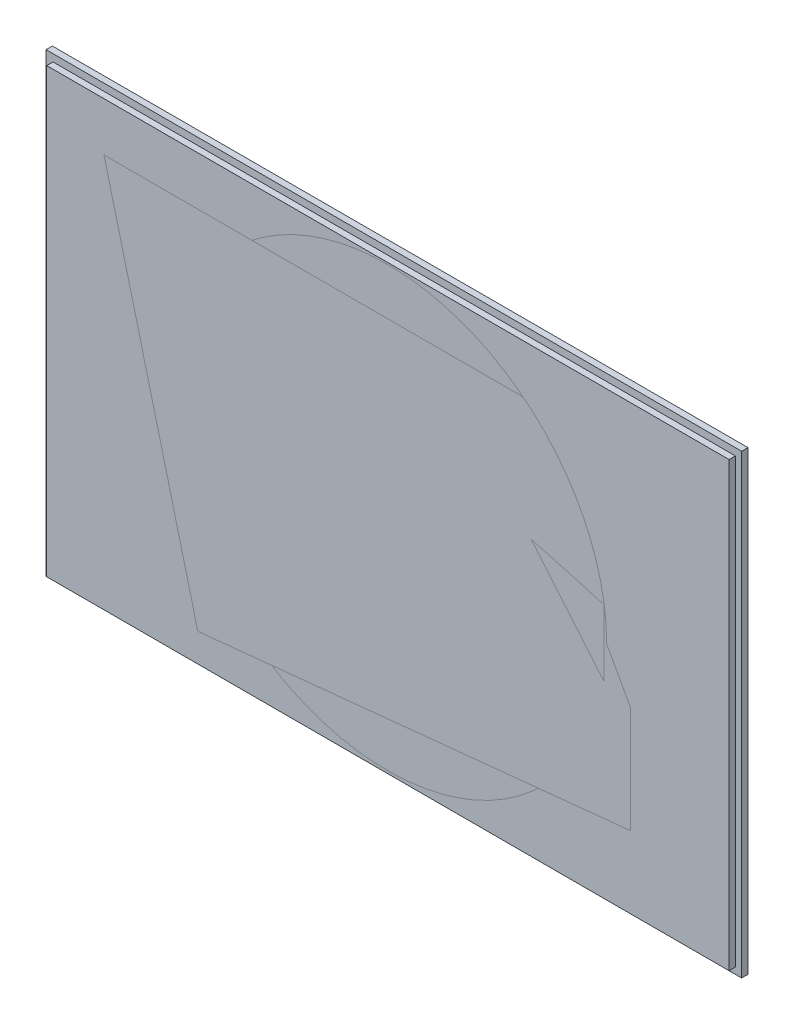
ISO-10303-21;
HEADER;
FILE_DESCRIPTION(('STEP AP214'),'2;1');
FILE_NAME('part.step','',(''),(''),'','','');
FILE_SCHEMA(('AUTOMOTIVE_DESIGN { 1 0 10303 214 1 1 1 1 }'));
ENDSEC;
DATA;
#1=APPLICATION_CONTEXT('core data for automotive mechanical design processes');
#2=APPLICATION_PROTOCOL_DEFINITION('international standard','automotive_design',2000,#1);
#3=PRODUCT_CONTEXT('',#1,'mechanical');
#4=PRODUCT('Part','Part','',(#3));
#5=PRODUCT_RELATED_PRODUCT_CATEGORY('part','',(#4));
#6=PRODUCT_DEFINITION_FORMATION('','',#4);
#7=PRODUCT_DEFINITION_CONTEXT('part definition',#1,'design');
#8=PRODUCT_DEFINITION('design','',#6,#7);
#9=PRODUCT_DEFINITION_SHAPE('','',#8);
#10=(LENGTH_UNIT() NAMED_UNIT(*) SI_UNIT(.MILLI.,.METRE.));
#11=(NAMED_UNIT(*) PLANE_ANGLE_UNIT() SI_UNIT($,.RADIAN.));
#12=(NAMED_UNIT(*) SI_UNIT($,.STERADIAN.) SOLID_ANGLE_UNIT());
#13=UNCERTAINTY_MEASURE_WITH_UNIT(LENGTH_MEASURE(1.E-05),#10,'distance_accuracy_value','');
#14=(GEOMETRIC_REPRESENTATION_CONTEXT(3) GLOBAL_UNCERTAINTY_ASSIGNED_CONTEXT((#13)) GLOBAL_UNIT_ASSIGNED_CONTEXT((#10,
#11,#12)) REPRESENTATION_CONTEXT('',''));
#15=CARTESIAN_POINT('',(0.,0.,0.));
#16=DIRECTION('',(0.,0.,1.));
#17=DIRECTION('',(1.,0.,0.));
#18=AXIS2_PLACEMENT_3D('',#15,#16,#17);
#19=CARTESIAN_POINT('',(0.,0.,4.));
#20=DIRECTION('',(0.,0.,-1.));
#21=DIRECTION('',(-1.,0.,0.));
#22=AXIS2_PLACEMENT_3D('',#19,#20,#21);
#23=CYLINDRICAL_SURFACE('',#22,69.248780578544);
#24=CARTESIAN_POINT('',(0.,0.,4.));
#25=DIRECTION('',(0.,0.,1.));
#26=DIRECTION('',(1.,0.,0.));
#27=AXIS2_PLACEMENT_3D('',#24,#25,#26);
#28=CIRCLE('',#27,69.248780578544);
#29=CARTESIAN_POINT('',(69.248780578544,0.,4.));
#30=VERTEX_POINT('',#29);
#31=EDGE_CURVE('E11',#30,#30,#28,.T.);
#32=ORIENTED_EDGE('',*,*,#31,.F.);
#33=EDGE_LOOP('',(#32));
#34=FACE_BOUND('',#33,.T.);
#35=CARTESIAN_POINT('',(0.,0.,2.));
#36=DIRECTION('',(0.,0.,1.));
#37=DIRECTION('',(1.,0.,0.));
#38=AXIS2_PLACEMENT_3D('',#35,#36,#37);
#39=CIRCLE('',#38,69.248780578544);
#40=CARTESIAN_POINT('',(69.248780578544,0.,2.));
#41=VERTEX_POINT('',#40);
#42=EDGE_CURVE('E47',#41,#41,#39,.T.);
#43=ORIENTED_EDGE('',*,*,#42,.T.);
#44=EDGE_LOOP('',(#43));
#45=FACE_BOUND('',#44,.T.);
#46=ADVANCED_FACE('F44',(#34,#45),#23,.T.);
#47=CARTESIAN_POINT('',(0.,0.,4.));
#48=DIRECTION('',(0.,0.,1.));
#49=DIRECTION('',(1.,0.,0.));
#50=AXIS2_PLACEMENT_3D('',#47,#48,#49);
#51=PLANE('',#50);
#52=ORIENTED_EDGE('',*,*,#31,.T.);
#53=EDGE_LOOP('',(#52));
#54=FACE_BOUND('',#53,.T.);
#55=ADVANCED_FACE('F59',(#54),#51,.T.);
#56=CARTESIAN_POINT('',(0.,0.,2.));
#57=DIRECTION('',(0.,0.,1.));
#58=DIRECTION('',(1.,0.,0.));
#59=AXIS2_PLACEMENT_3D('',#56,#57,#58);
#60=PLANE('',#59);
#61=ORIENTED_EDGE('',*,*,#42,.F.);
#62=EDGE_LOOP('',(#61));
#63=FACE_BOUND('',#62,.T.);
#64=ADVANCED_FACE('F57',(#63),#60,.F.);
#65=CLOSED_SHELL('',(#46,#55,#64));
#66=MANIFOLD_SOLID_BREP('B2_NOT_SHOWN',#65);
#67=CARTESIAN_POINT('',(0.,0.,4.));
#68=DIRECTION('',(0.,0.,1.));
#69=DIRECTION('',(1.,0.,0.));
#70=AXIS2_PLACEMENT_3D('',#67,#68,#69);
#71=PLANE('',#70);
#72=DIRECTION('',(0.,-1.,0.));
#73=VECTOR('',#72,1.);
#74=CARTESIAN_POINT('',(-107.655471031834,69.8068653838549,4.));
#75=LINE('',#74,#73);
#76=CARTESIAN_POINT('',(-107.655471031834,69.8068653838549,4.));
#77=VERTEX_POINT('',#76);
#78=CARTESIAN_POINT('',(-107.655471031834,-70.0575184013911,4.));
#79=VERTEX_POINT('',#78);
#80=EDGE_CURVE('E147',#77,#79,#75,.T.);
#81=ORIENTED_EDGE('',*,*,#80,.T.);
#82=DIRECTION('',(1.,0.,0.));
#83=VECTOR('',#82,1.);
#84=CARTESIAN_POINT('',(-107.655471031834,-70.0575184013911,4.));
#85=LINE('',#84,#83);
#86=CARTESIAN_POINT('',(107.90612404937,-70.0575184013911,4.));
#87=VERTEX_POINT('',#86);
#88=EDGE_CURVE('E142',#79,#87,#85,.T.);
#89=ORIENTED_EDGE('',*,*,#88,.T.);
#90=DIRECTION('',(0.,1.,0.));
#91=VECTOR('',#90,1.);
#92=CARTESIAN_POINT('',(107.90612404937,69.8068653838549,4.));
#93=LINE('',#92,#91);
#94=CARTESIAN_POINT('',(107.90612404937,69.8068653838549,4.));
#95=VERTEX_POINT('',#94);
#96=EDGE_CURVE('E145',#87,#95,#93,.T.);
#97=ORIENTED_EDGE('',*,*,#96,.T.);
#98=DIRECTION('',(-1.,0.,0.));
#99=VECTOR('',#98,1.);
#100=CARTESIAN_POINT('',(-107.655471031834,69.8068653838549,4.));
#101=LINE('',#100,#99);
#102=EDGE_CURVE('E112',#95,#77,#101,.T.);
#103=ORIENTED_EDGE('',*,*,#102,.T.);
#104=EDGE_LOOP('',(#81,#89,#97,#103));
#105=FACE_BOUND('',#104,.T.);
#106=CARTESIAN_POINT('',(0.,0.,4.));
#107=DIRECTION('',(0.,0.,1.));
#108=DIRECTION('',(1.,0.,0.));
#109=AXIS2_PLACEMENT_3D('',#106,#107,#108);
#110=CIRCLE('',#109,69.248780578544);
#111=CARTESIAN_POINT('',(69.248780578544,0.,4.));
#112=VERTEX_POINT('',#111);
#113=EDGE_CURVE('E162',#112,#112,#110,.T.);
#114=ORIENTED_EDGE('',*,*,#113,.F.);
#115=EDGE_LOOP('',(#114));
#116=FACE_BOUND('',#115,.T.);
#117=ADVANCED_FACE('F95',(#105,#116),#71,.T.);
#118=CARTESIAN_POINT('',(0.,0.,2.));
#119=DIRECTION('',(0.,0.,1.));
#120=DIRECTION('',(1.,0.,0.));
#121=AXIS2_PLACEMENT_3D('',#118,#119,#120);
#122=PLANE('',#121);
#123=DIRECTION('',(0.,-1.,0.));
#124=VECTOR('',#123,1.);
#125=CARTESIAN_POINT('',(-107.655471031834,69.8068653838549,2.));
#126=LINE('',#125,#124);
#127=CARTESIAN_POINT('',(-107.655471031834,69.8068653838549,2.));
#128=VERTEX_POINT('',#127);
#129=CARTESIAN_POINT('',(-107.655471031834,-70.0575184013911,2.));
#130=VERTEX_POINT('',#129);
#131=EDGE_CURVE('E159',#128,#130,#126,.T.);
#132=ORIENTED_EDGE('',*,*,#131,.F.);
#133=DIRECTION('',(-1.,0.,0.));
#134=VECTOR('',#133,1.);
#135=CARTESIAN_POINT('',(-107.655471031834,69.8068653838549,2.));
#136=LINE('',#135,#134);
#137=CARTESIAN_POINT('',(107.90612404937,69.8068653838549,2.));
#138=VERTEX_POINT('',#137);
#139=EDGE_CURVE('E135',#138,#128,#136,.T.);
#140=ORIENTED_EDGE('',*,*,#139,.F.);
#141=DIRECTION('',(0.,1.,0.));
#142=VECTOR('',#141,1.);
#143=CARTESIAN_POINT('',(107.90612404937,69.8068653838549,2.));
#144=LINE('',#143,#142);
#145=CARTESIAN_POINT('',(107.90612404937,-70.0575184013911,2.));
#146=VERTEX_POINT('',#145);
#147=EDGE_CURVE('E129',#146,#138,#144,.T.);
#148=ORIENTED_EDGE('',*,*,#147,.F.);
#149=DIRECTION('',(1.,0.,0.));
#150=VECTOR('',#149,1.);
#151=CARTESIAN_POINT('',(-107.655471031834,-70.0575184013911,2.));
#152=LINE('',#151,#150);
#153=EDGE_CURVE('E151',#130,#146,#152,.T.);
#154=ORIENTED_EDGE('',*,*,#153,.F.);
#155=EDGE_LOOP('',(#132,#140,#148,#154));
#156=FACE_BOUND('',#155,.T.);
#157=CARTESIAN_POINT('',(0.,0.,2.));
#158=DIRECTION('',(0.,0.,1.));
#159=DIRECTION('',(1.,0.,0.));
#160=AXIS2_PLACEMENT_3D('',#157,#158,#159);
#161=CIRCLE('',#160,69.248780578544);
#162=CARTESIAN_POINT('',(69.248780578544,0.,2.));
#163=VERTEX_POINT('',#162);
#164=EDGE_CURVE('E176',#163,#163,#161,.T.);
#165=ORIENTED_EDGE('',*,*,#164,.T.);
#166=EDGE_LOOP('',(#165));
#167=FACE_BOUND('',#166,.T.);
#168=ADVANCED_FACE('F170',(#156,#167),#122,.F.);
#169=CARTESIAN_POINT('',(-107.655471031834,69.8068653838549,4.));
#170=DIRECTION('',(1.,0.,0.));
#171=DIRECTION('',(0.,0.,-1.));
#172=AXIS2_PLACEMENT_3D('',#169,#170,#171);
#173=PLANE('',#172);
#174=ORIENTED_EDGE('',*,*,#131,.T.);
#175=DIRECTION('',(0.,0.,-1.));
#176=VECTOR('',#175,1.);
#177=CARTESIAN_POINT('',(-107.655471031834,-70.0575184013911,4.));
#178=LINE('',#177,#176);
#179=EDGE_CURVE('E42',#79,#130,#178,.T.);
#180=ORIENTED_EDGE('',*,*,#179,.F.);
#181=ORIENTED_EDGE('',*,*,#80,.F.);
#182=DIRECTION('',(0.,0.,-1.));
#183=VECTOR('',#182,1.);
#184=CARTESIAN_POINT('',(-107.655471031834,69.8068653838549,4.));
#185=LINE('',#184,#183);
#186=EDGE_CURVE('E155',#77,#128,#185,.T.);
#187=ORIENTED_EDGE('',*,*,#186,.T.);
#188=EDGE_LOOP('',(#174,#180,#181,#187));
#189=FACE_BOUND('',#188,.T.);
#190=ADVANCED_FACE('F97',(#189),#173,.F.);
#191=CARTESIAN_POINT('',(-107.655471031834,-70.0575184013911,4.));
#192=DIRECTION('',(0.,1.,0.));
#193=DIRECTION('',(0.,0.,1.));
#194=AXIS2_PLACEMENT_3D('',#191,#192,#193);
#195=PLANE('',#194);
#196=ORIENTED_EDGE('',*,*,#153,.T.);
#197=DIRECTION('',(0.,0.,-1.));
#198=VECTOR('',#197,1.);
#199=CARTESIAN_POINT('',(107.90612404937,-70.0575184013911,4.));
#200=LINE('',#199,#198);
#201=EDGE_CURVE('E104',#87,#146,#200,.T.);
#202=ORIENTED_EDGE('',*,*,#201,.F.);
#203=ORIENTED_EDGE('',*,*,#88,.F.);
#204=ORIENTED_EDGE('',*,*,#179,.T.);
#205=EDGE_LOOP('',(#196,#202,#203,#204));
#206=FACE_BOUND('',#205,.T.);
#207=ADVANCED_FACE('F150',(#206),#195,.F.);
#208=CARTESIAN_POINT('',(107.90612404937,69.8068653838549,4.));
#209=DIRECTION('',(-1.,0.,0.));
#210=DIRECTION('',(0.,0.,1.));
#211=AXIS2_PLACEMENT_3D('',#208,#209,#210);
#212=PLANE('',#211);
#213=ORIENTED_EDGE('',*,*,#147,.T.);
#214=DIRECTION('',(0.,0.,-1.));
#215=VECTOR('',#214,1.);
#216=CARTESIAN_POINT('',(107.90612404937,69.8068653838549,4.));
#217=LINE('',#216,#215);
#218=EDGE_CURVE('E152',#95,#138,#217,.T.);
#219=ORIENTED_EDGE('',*,*,#218,.F.);
#220=ORIENTED_EDGE('',*,*,#96,.F.);
#221=ORIENTED_EDGE('',*,*,#201,.T.);
#222=EDGE_LOOP('',(#213,#219,#220,#221));
#223=FACE_BOUND('',#222,.T.);
#224=ADVANCED_FACE('F153',(#223),#212,.F.);
#225=CARTESIAN_POINT('',(-107.655471031834,69.8068653838549,4.));
#226=DIRECTION('',(0.,-1.,0.));
#227=DIRECTION('',(0.,0.,-1.));
#228=AXIS2_PLACEMENT_3D('',#225,#226,#227);
#229=PLANE('',#228);
#230=ORIENTED_EDGE('',*,*,#139,.T.);
#231=ORIENTED_EDGE('',*,*,#186,.F.);
#232=ORIENTED_EDGE('',*,*,#102,.F.);
#233=ORIENTED_EDGE('',*,*,#218,.T.);
#234=EDGE_LOOP('',(#230,#231,#232,#233));
#235=FACE_BOUND('',#234,.T.);
#236=ADVANCED_FACE('F167',(#235),#229,.F.);
#237=CARTESIAN_POINT('',(0.,0.,199.865129343951));
#238=DIRECTION('',(0.,0.,-1.));
#239=DIRECTION('',(-1.,0.,0.));
#240=AXIS2_PLACEMENT_3D('',#237,#238,#239);
#241=CYLINDRICAL_SURFACE('',#240,69.248780578544);
#242=ORIENTED_EDGE('',*,*,#164,.F.);
#243=EDGE_LOOP('',(#242));
#244=FACE_BOUND('',#243,.T.);
#245=ORIENTED_EDGE('',*,*,#113,.T.);
#246=EDGE_LOOP('',(#245));
#247=FACE_BOUND('',#246,.T.);
#248=ADVANCED_FACE('F180',(#244,#247),#241,.F.);
#249=CLOSED_SHELL('',(#117,#168,#190,#207,#224,#236,#248));
#250=MANIFOLD_SOLID_BREP('B6',#249);
#251=CARTESIAN_POINT('',(-59.9294069197072,-61.1122561674762,4.));
#252=DIRECTION('',(0.968626365724741,0.248521555650369,0.));
#253=DIRECTION('',(-0.248521555650369,0.968626365724741,0.));
#254=AXIS2_PLACEMENT_3D('',#251,#252,#253);
#255=PLANE('',#254);
#256=DIRECTION('',(0.248521555650369,-0.968626365724741,0.));
#257=VECTOR('',#256,1.);
#258=CARTESIAN_POINT('',(-59.9294069197072,-61.1122561674762,2.));
#259=LINE('',#258,#257);
#260=CARTESIAN_POINT('',(-89.5661441915081,54.398549486379,2.));
#261=VERTEX_POINT('',#260);
#262=CARTESIAN_POINT('',(-59.9294069197072,-61.1122561674762,2.));
#263=VERTEX_POINT('',#262);
#264=EDGE_CURVE('E323',#261,#263,#259,.T.);
#265=ORIENTED_EDGE('',*,*,#264,.T.);
#266=DIRECTION('',(0.,0.,-1.));
#267=VECTOR('',#266,1.);
#268=CARTESIAN_POINT('',(-59.9294069197072,-61.1122561674762,4.));
#269=LINE('',#268,#267);
#270=CARTESIAN_POINT('',(-59.9294069197072,-61.1122561674762,4.));
#271=VERTEX_POINT('',#270);
#272=EDGE_CURVE('E93',#271,#263,#269,.T.);
#273=ORIENTED_EDGE('',*,*,#272,.F.);
#274=DIRECTION('',(0.248521555650369,-0.968626365724741,0.));
#275=VECTOR('',#274,1.);
#276=CARTESIAN_POINT('',(-59.9294069197072,-61.1122561674762,4.));
#277=LINE('',#276,#275);
#278=CARTESIAN_POINT('',(-89.5661441915081,54.398549486379,4.));
#279=VERTEX_POINT('',#278);
#280=EDGE_CURVE('E331',#279,#271,#277,.T.);
#281=ORIENTED_EDGE('',*,*,#280,.F.);
#282=DIRECTION('',(0.,0.,-1.));
#283=VECTOR('',#282,1.);
#284=CARTESIAN_POINT('',(-89.5661441915081,54.398549486379,4.));
#285=LINE('',#284,#283);
#286=EDGE_CURVE('E319',#279,#261,#285,.T.);
#287=ORIENTED_EDGE('',*,*,#286,.T.);
#288=EDGE_LOOP('',(#265,#273,#281,#287));
#289=FACE_BOUND('',#288,.T.);
#290=ADVANCED_FACE('F249',(#289),#255,.F.);
#291=CARTESIAN_POINT('',(76.7007434798709,-47.3210765563495,4.));
#292=DIRECTION('',(-0.100427733326233,0.99494435541841,0.));
#293=DIRECTION('',(-0.99494435541841,-0.100427733326233,0.));
#294=AXIS2_PLACEMENT_3D('',#291,#292,#293);
#295=PLANE('',#294);
#296=DIRECTION('',(0.99494435541841,0.100427733326233,0.));
#297=VECTOR('',#296,1.);
#298=CARTESIAN_POINT('',(76.7007434798709,-47.3210765563495,2.));
#299=LINE('',#298,#297);
#300=CARTESIAN_POINT('',(76.7007434798709,-47.3210765563495,2.));
#301=VERTEX_POINT('',#300);
#302=EDGE_CURVE('E326',#263,#301,#299,.T.);
#303=ORIENTED_EDGE('',*,*,#302,.T.);
#304=DIRECTION('',(0.,0.,-1.));
#305=VECTOR('',#304,1.);
#306=CARTESIAN_POINT('',(76.7007434798709,-47.3210765563495,4.));
#307=LINE('',#306,#305);
#308=CARTESIAN_POINT('',(76.7007434798709,-47.3210765563495,4.));
#309=VERTEX_POINT('',#308);
#310=EDGE_CURVE('E257',#309,#301,#307,.T.);
#311=ORIENTED_EDGE('',*,*,#310,.F.);
#312=DIRECTION('',(0.99494435541841,0.100427733326233,0.));
#313=VECTOR('',#312,1.);
#314=CARTESIAN_POINT('',(76.7007434798709,-47.3210765563495,4.));
#315=LINE('',#314,#313);
#316=EDGE_CURVE('E299',#271,#309,#315,.T.);
#317=ORIENTED_EDGE('',*,*,#316,.F.);
#318=ORIENTED_EDGE('',*,*,#272,.T.);
#319=EDGE_LOOP('',(#303,#311,#317,#318));
#320=FACE_BOUND('',#319,.T.);
#321=ADVANCED_FACE('F350',(#320),#295,.F.);
#322=CARTESIAN_POINT('',(76.7007434798709,8.02063687470778,4.));
#323=DIRECTION('',(-1.,0.,0.));
#324=DIRECTION('',(0.,0.,1.));
#325=AXIS2_PLACEMENT_3D('',#322,#323,#324);
#326=PLANE('',#325);
#327=DIRECTION('',(0.,1.,0.));
#328=VECTOR('',#327,1.);
#329=CARTESIAN_POINT('',(76.7007434798709,8.02063687470778,2.));
#330=LINE('',#329,#328);
#331=CARTESIAN_POINT('',(76.7007434798709,8.02063687470778,2.));
#332=VERTEX_POINT('',#331);
#333=EDGE_CURVE('E314',#301,#332,#330,.T.);
#334=ORIENTED_EDGE('',*,*,#333,.T.);
#335=DIRECTION('',(0.,0.,-1.));
#336=VECTOR('',#335,1.);
#337=CARTESIAN_POINT('',(76.7007434798709,8.02063687470778,4.));
#338=LINE('',#337,#336);
#339=CARTESIAN_POINT('',(76.7007434798709,8.02063687470778,4.));
#340=VERTEX_POINT('',#339);
#341=EDGE_CURVE('E311',#340,#332,#338,.T.);
#342=ORIENTED_EDGE('',*,*,#341,.F.);
#343=DIRECTION('',(0.,1.,0.));
#344=VECTOR('',#343,1.);
#345=CARTESIAN_POINT('',(76.7007434798709,8.02063687470778,4.));
#346=LINE('',#345,#344);
#347=EDGE_CURVE('E303',#309,#340,#346,.T.);
#348=ORIENTED_EDGE('',*,*,#347,.F.);
#349=ORIENTED_EDGE('',*,*,#310,.T.);
#350=EDGE_LOOP('',(#334,#342,#348,#349));
#351=FACE_BOUND('',#350,.T.);
#352=ADVANCED_FACE('F312',(#351),#326,.F.);
#353=CARTESIAN_POINT('',(86.3713918290614,54.398549486379,4.));
#354=DIRECTION('',(-0.978944229728617,0.204127889032939,0.));
#355=DIRECTION('',(-0.204127889032939,-0.978944229728617,0.));
#356=AXIS2_PLACEMENT_3D('',#353,#354,#355);
#357=PLANE('',#356);
#358=DIRECTION('',(0.204127889032939,0.978944229728617,0.));
#359=VECTOR('',#358,1.);
#360=CARTESIAN_POINT('',(86.3713918290614,54.398549486379,2.));
#361=LINE('',#360,#359);
#362=CARTESIAN_POINT('',(86.3713918290614,54.398549486379,2.));
#363=VERTEX_POINT('',#362);
#364=EDGE_CURVE('E285',#332,#363,#361,.T.);
#365=ORIENTED_EDGE('',*,*,#364,.T.);
#366=DIRECTION('',(0.,0.,-1.));
#367=VECTOR('',#366,1.);
#368=CARTESIAN_POINT('',(86.3713918290614,54.398549486379,4.));
#369=LINE('',#368,#367);
#370=CARTESIAN_POINT('',(86.3713918290614,54.398549486379,4.));
#371=VERTEX_POINT('',#370);
#372=EDGE_CURVE('E315',#371,#363,#369,.T.);
#373=ORIENTED_EDGE('',*,*,#372,.F.);
#374=DIRECTION('',(0.204127889032939,0.978944229728617,0.));
#375=VECTOR('',#374,1.);
#376=CARTESIAN_POINT('',(86.3713918290614,54.398549486379,4.));
#377=LINE('',#376,#375);
#378=EDGE_CURVE('E307',#340,#371,#377,.T.);
#379=ORIENTED_EDGE('',*,*,#378,.F.);
#380=ORIENTED_EDGE('',*,*,#341,.T.);
#381=EDGE_LOOP('',(#365,#373,#379,#380));
#382=FACE_BOUND('',#381,.T.);
#383=ADVANCED_FACE('F317',(#382),#357,.F.);
#384=CARTESIAN_POINT('',(-89.5661441915081,54.398549486379,4.));
#385=DIRECTION('',(0.,-1.,0.));
#386=DIRECTION('',(0.,0.,-1.));
#387=AXIS2_PLACEMENT_3D('',#384,#385,#386);
#388=PLANE('',#387);
#389=DIRECTION('',(-1.,0.,0.));
#390=VECTOR('',#389,1.);
#391=CARTESIAN_POINT('',(-89.5661441915081,54.398549486379,2.));
#392=LINE('',#391,#390);
#393=EDGE_CURVE('E291',#363,#261,#392,.T.);
#394=ORIENTED_EDGE('',*,*,#393,.T.);
#395=ORIENTED_EDGE('',*,*,#286,.F.);
#396=DIRECTION('',(-1.,0.,0.));
#397=VECTOR('',#396,1.);
#398=CARTESIAN_POINT('',(-89.5661441915081,54.398549486379,4.));
#399=LINE('',#398,#397);
#400=EDGE_CURVE('E265',#371,#279,#399,.T.);
#401=ORIENTED_EDGE('',*,*,#400,.F.);
#402=ORIENTED_EDGE('',*,*,#372,.T.);
#403=EDGE_LOOP('',(#394,#395,#401,#402));
#404=FACE_BOUND('',#403,.T.);
#405=ADVANCED_FACE('F339',(#404),#388,.F.);
#406=CARTESIAN_POINT('',(0.,0.,4.));
#407=DIRECTION('',(0.,0.,1.));
#408=DIRECTION('',(1.,0.,0.));
#409=AXIS2_PLACEMENT_3D('',#406,#407,#408);
#410=PLANE('',#409);
#411=ORIENTED_EDGE('',*,*,#280,.T.);
#412=ORIENTED_EDGE('',*,*,#316,.T.);
#413=ORIENTED_EDGE('',*,*,#347,.T.);
#414=ORIENTED_EDGE('',*,*,#378,.T.);
#415=ORIENTED_EDGE('',*,*,#400,.T.);
#416=EDGE_LOOP('',(#411,#412,#413,#414,#415));
#417=FACE_BOUND('',#416,.T.);
#418=ADVANCED_FACE('F305',(#417),#410,.T.);
#419=CARTESIAN_POINT('',(0.,0.,2.));
#420=DIRECTION('',(0.,0.,1.));
#421=DIRECTION('',(1.,0.,0.));
#422=AXIS2_PLACEMENT_3D('',#419,#420,#421);
#423=PLANE('',#422);
#424=ORIENTED_EDGE('',*,*,#264,.F.);
#425=ORIENTED_EDGE('',*,*,#393,.F.);
#426=ORIENTED_EDGE('',*,*,#364,.F.);
#427=ORIENTED_EDGE('',*,*,#333,.F.);
#428=ORIENTED_EDGE('',*,*,#302,.F.);
#429=EDGE_LOOP('',(#424,#425,#426,#427,#428));
#430=FACE_BOUND('',#429,.T.);
#431=ADVANCED_FACE('F335',(#430),#423,.F.);
#432=CLOSED_SHELL('',(#290,#321,#352,#383,#405,#418,#431));
#433=MANIFOLD_SOLID_BREP('B36_NOT_SHOWN',#432);
#434=CARTESIAN_POINT('',(109.881768674486,-72.0558022459359,2.));
#435=DIRECTION('',(-1.,0.,0.));
#436=DIRECTION('',(0.,0.,1.));
#437=AXIS2_PLACEMENT_3D('',#434,#435,#436);
#438=PLANE('',#437);
#439=DIRECTION('',(0.,1.,0.));
#440=VECTOR('',#439,1.);
#441=CARTESIAN_POINT('',(109.881768674486,-72.0558022459359,0.));
#442=LINE('',#441,#440);
#443=CARTESIAN_POINT('',(109.881768674486,-72.0558022459359,0.));
#444=VERTEX_POINT('',#443);
#445=CARTESIAN_POINT('',(109.881768674486,72.0558022459359,0.));
#446=VERTEX_POINT('',#445);
#447=EDGE_CURVE('E462',#444,#446,#442,.T.);
#448=ORIENTED_EDGE('',*,*,#447,.T.);
#449=DIRECTION('',(0.,0.,-1.));
#450=VECTOR('',#449,1.);
#451=CARTESIAN_POINT('',(109.881768674486,72.0558022459359,2.));
#452=LINE('',#451,#450);
#453=CARTESIAN_POINT('',(109.881768674486,72.0558022459359,2.));
#454=VERTEX_POINT('',#453);
#455=EDGE_CURVE('E247',#454,#446,#452,.T.);
#456=ORIENTED_EDGE('',*,*,#455,.F.);
#457=DIRECTION('',(0.,1.,0.));
#458=VECTOR('',#457,1.);
#459=CARTESIAN_POINT('',(109.881768674486,-72.0558022459359,2.));
#460=LINE('',#459,#458);
#461=CARTESIAN_POINT('',(109.881768674486,-72.0558022459359,2.));
#462=VERTEX_POINT('',#461);
#463=EDGE_CURVE('E450',#462,#454,#460,.T.);
#464=ORIENTED_EDGE('',*,*,#463,.F.);
#465=DIRECTION('',(0.,0.,-1.));
#466=VECTOR('',#465,1.);
#467=CARTESIAN_POINT('',(109.881768674486,-72.0558022459359,2.));
#468=LINE('',#467,#466);
#469=EDGE_CURVE('E458',#462,#444,#468,.T.);
#470=ORIENTED_EDGE('',*,*,#469,.T.);
#471=EDGE_LOOP('',(#448,#456,#464,#470));
#472=FACE_BOUND('',#471,.T.);
#473=ADVANCED_FACE('F399',(#472),#438,.F.);
#474=CARTESIAN_POINT('',(-109.881768674486,72.0558022459359,2.));
#475=DIRECTION('',(0.,-1.,0.));
#476=DIRECTION('',(0.,0.,-1.));
#477=AXIS2_PLACEMENT_3D('',#474,#475,#476);
#478=PLANE('',#477);
#479=DIRECTION('',(-1.,0.,0.));
#480=VECTOR('',#479,1.);
#481=CARTESIAN_POINT('',(-109.881768674486,72.0558022459359,0.));
#482=LINE('',#481,#480);
#483=CARTESIAN_POINT('',(-109.881768674486,72.0558022459359,0.));
#484=VERTEX_POINT('',#483);
#485=EDGE_CURVE('E454',#446,#484,#482,.T.);
#486=ORIENTED_EDGE('',*,*,#485,.T.);
#487=DIRECTION('',(0.,0.,-1.));
#488=VECTOR('',#487,1.);
#489=CARTESIAN_POINT('',(-109.881768674486,72.0558022459359,2.));
#490=LINE('',#489,#488);
#491=CARTESIAN_POINT('',(-109.881768674486,72.0558022459359,2.));
#492=VERTEX_POINT('',#491);
#493=EDGE_CURVE('E407',#492,#484,#490,.T.);
#494=ORIENTED_EDGE('',*,*,#493,.F.);
#495=DIRECTION('',(-1.,0.,0.));
#496=VECTOR('',#495,1.);
#497=CARTESIAN_POINT('',(-109.881768674486,72.0558022459359,2.));
#498=LINE('',#497,#496);
#499=EDGE_CURVE('E445',#454,#492,#498,.T.);
#500=ORIENTED_EDGE('',*,*,#499,.F.);
#501=ORIENTED_EDGE('',*,*,#455,.T.);
#502=EDGE_LOOP('',(#486,#494,#500,#501));
#503=FACE_BOUND('',#502,.T.);
#504=ADVANCED_FACE('F453',(#503),#478,.F.);
#505=CARTESIAN_POINT('',(-109.881768674486,-72.0558022459359,2.));
#506=DIRECTION('',(1.,0.,0.));
#507=DIRECTION('',(0.,0.,-1.));
#508=AXIS2_PLACEMENT_3D('',#505,#506,#507);
#509=PLANE('',#508);
#510=DIRECTION('',(0.,-1.,0.));
#511=VECTOR('',#510,1.);
#512=CARTESIAN_POINT('',(-109.881768674486,-72.0558022459359,0.));
#513=LINE('',#512,#511);
#514=CARTESIAN_POINT('',(-109.881768674486,-72.0558022459359,0.));
#515=VERTEX_POINT('',#514);
#516=EDGE_CURVE('E432',#484,#515,#513,.T.);
#517=ORIENTED_EDGE('',*,*,#516,.T.);
#518=DIRECTION('',(0.,0.,-1.));
#519=VECTOR('',#518,1.);
#520=CARTESIAN_POINT('',(-109.881768674486,-72.0558022459359,2.));
#521=LINE('',#520,#519);
#522=CARTESIAN_POINT('',(-109.881768674486,-72.0558022459359,2.));
#523=VERTEX_POINT('',#522);
#524=EDGE_CURVE('E455',#523,#515,#521,.T.);
#525=ORIENTED_EDGE('',*,*,#524,.F.);
#526=DIRECTION('',(0.,-1.,0.));
#527=VECTOR('',#526,1.);
#528=CARTESIAN_POINT('',(-109.881768674486,-72.0558022459359,2.));
#529=LINE('',#528,#527);
#530=EDGE_CURVE('E448',#492,#523,#529,.T.);
#531=ORIENTED_EDGE('',*,*,#530,.F.);
#532=ORIENTED_EDGE('',*,*,#493,.T.);
#533=EDGE_LOOP('',(#517,#525,#531,#532));
#534=FACE_BOUND('',#533,.T.);
#535=ADVANCED_FACE('F456',(#534),#509,.F.);
#536=CARTESIAN_POINT('',(-109.881768674486,-72.0558022459359,2.));
#537=DIRECTION('',(0.,1.,0.));
#538=DIRECTION('',(0.,0.,1.));
#539=AXIS2_PLACEMENT_3D('',#536,#537,#538);
#540=PLANE('',#539);
#541=DIRECTION('',(1.,0.,0.));
#542=VECTOR('',#541,1.);
#543=CARTESIAN_POINT('',(-109.881768674486,-72.0558022459359,0.));
#544=LINE('',#543,#542);
#545=EDGE_CURVE('E438',#515,#444,#544,.T.);
#546=ORIENTED_EDGE('',*,*,#545,.T.);
#547=ORIENTED_EDGE('',*,*,#469,.F.);
#548=DIRECTION('',(1.,0.,0.));
#549=VECTOR('',#548,1.);
#550=CARTESIAN_POINT('',(-109.881768674486,-72.0558022459359,2.));
#551=LINE('',#550,#549);
#552=EDGE_CURVE('E415',#523,#462,#551,.T.);
#553=ORIENTED_EDGE('',*,*,#552,.F.);
#554=ORIENTED_EDGE('',*,*,#524,.T.);
#555=EDGE_LOOP('',(#546,#547,#553,#554));
#556=FACE_BOUND('',#555,.T.);
#557=ADVANCED_FACE('F469',(#556),#540,.F.);
#558=CARTESIAN_POINT('',(0.,0.,2.));
#559=DIRECTION('',(0.,0.,-1.));
#560=DIRECTION('',(-1.,0.,0.));
#561=AXIS2_PLACEMENT_3D('',#558,#559,#560);
#562=PLANE('',#561);
#563=ORIENTED_EDGE('',*,*,#463,.T.);
#564=ORIENTED_EDGE('',*,*,#499,.T.);
#565=ORIENTED_EDGE('',*,*,#530,.T.);
#566=ORIENTED_EDGE('',*,*,#552,.T.);
#567=EDGE_LOOP('',(#563,#564,#565,#566));
#568=FACE_BOUND('',#567,.T.);
#569=ADVANCED_FACE('F446',(#568),#562,.F.);
#570=CARTESIAN_POINT('',(0.,0.,0.));
#571=DIRECTION('',(0.,0.,-1.));
#572=DIRECTION('',(-1.,0.,0.));
#573=AXIS2_PLACEMENT_3D('',#570,#571,#572);
#574=PLANE('',#573);
#575=ORIENTED_EDGE('',*,*,#447,.F.);
#576=ORIENTED_EDGE('',*,*,#545,.F.);
#577=ORIENTED_EDGE('',*,*,#516,.F.);
#578=ORIENTED_EDGE('',*,*,#485,.F.);
#579=EDGE_LOOP('',(#575,#576,#577,#578));
#580=FACE_BOUND('',#579,.T.);
#581=ADVANCED_FACE('F472',(#580),#574,.T.);
#582=CLOSED_SHELL('',(#473,#504,#535,#557,#569,#581));
#583=MANIFOLD_SOLID_BREP('B87',#582);
#584=ADVANCED_BREP_SHAPE_REPRESENTATION('',(#18,#66,#250,#433,#583),#14);
#585=SHAPE_DEFINITION_REPRESENTATION(#9,#584);
ENDSEC;
END-ISO-10303-21;
